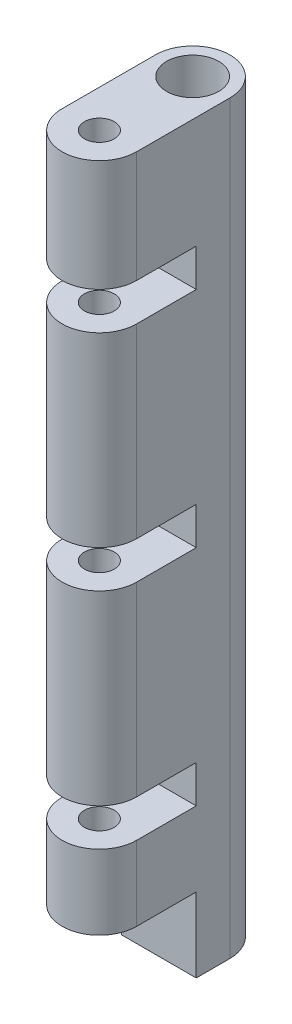
ISO-10303-21;
HEADER;
FILE_DESCRIPTION(('STEP AP214'),'2;1');
FILE_NAME('part.step','',(''),(''),'','','');
FILE_SCHEMA(('AUTOMOTIVE_DESIGN { 1 0 10303 214 1 1 1 1 }'));
ENDSEC;
DATA;
#1=APPLICATION_CONTEXT('core data for automotive mechanical design processes');
#2=APPLICATION_PROTOCOL_DEFINITION('international standard','automotive_design',2000,#1);
#3=PRODUCT_CONTEXT('',#1,'mechanical');
#4=PRODUCT('Part','Part','',(#3));
#5=PRODUCT_RELATED_PRODUCT_CATEGORY('part','',(#4));
#6=PRODUCT_DEFINITION_FORMATION('','',#4);
#7=PRODUCT_DEFINITION_CONTEXT('part definition',#1,'design');
#8=PRODUCT_DEFINITION('design','',#6,#7);
#9=PRODUCT_DEFINITION_SHAPE('','',#8);
#10=(LENGTH_UNIT() NAMED_UNIT(*) SI_UNIT(.MILLI.,.METRE.));
#11=(NAMED_UNIT(*) PLANE_ANGLE_UNIT() SI_UNIT($,.RADIAN.));
#12=(NAMED_UNIT(*) SI_UNIT($,.STERADIAN.) SOLID_ANGLE_UNIT());
#13=UNCERTAINTY_MEASURE_WITH_UNIT(LENGTH_MEASURE(1.E-05),#10,'distance_accuracy_value','');
#14=(GEOMETRIC_REPRESENTATION_CONTEXT(3) GLOBAL_UNCERTAINTY_ASSIGNED_CONTEXT((#13)) GLOBAL_UNIT_ASSIGNED_CONTEXT((#10,
#11,#12)) REPRESENTATION_CONTEXT('',''));
#15=CARTESIAN_POINT('',(0.,0.,0.));
#16=DIRECTION('',(0.,0.,1.));
#17=DIRECTION('',(1.,0.,0.));
#18=AXIS2_PLACEMENT_3D('',#15,#16,#17);
#19=CARTESIAN_POINT('',(0.,-25.6177180417115,15.8980893036825));
#20=DIRECTION('',(0.,1.,0.));
#21=DIRECTION('',(0.,0.,1.));
#22=AXIS2_PLACEMENT_3D('',#19,#20,#21);
#23=CYLINDRICAL_SURFACE('',#22,6.35);
#24=CARTESIAN_POINT('',(0.,108.0008,15.8980893036825));
#25=DIRECTION('',(0.,1.,0.));
#26=DIRECTION('',(0.,0.,1.));
#27=AXIS2_PLACEMENT_3D('',#24,#25,#26);
#28=CIRCLE('',#27,6.35);
#29=CARTESIAN_POINT('',(6.35,108.0008,15.8980893036825));
#30=VERTEX_POINT('',#29);
#31=CARTESIAN_POINT('',(-6.35,108.0008,15.8980893036825));
#32=VERTEX_POINT('',#31);
#33=EDGE_CURVE('E299',#30,#32,#28,.F.);
#34=ORIENTED_EDGE('',*,*,#33,.F.);
#35=DIRECTION('',(0.,1.,0.));
#36=VECTOR('',#35,1.);
#37=CARTESIAN_POINT('',(6.35,-25.6177180417115,15.8980893036825));
#38=LINE('',#37,#36);
#39=CARTESIAN_POINT('',(6.35,127.,15.8980893036825));
#40=VERTEX_POINT('',#39);
#41=EDGE_CURVE('E230',#30,#40,#38,.T.);
#42=ORIENTED_EDGE('',*,*,#41,.T.);
#43=CARTESIAN_POINT('',(0.,127.,15.8980893036825));
#44=DIRECTION('',(0.,1.,0.));
#45=DIRECTION('',(0.,0.,1.));
#46=AXIS2_PLACEMENT_3D('',#43,#44,#45);
#47=CIRCLE('',#46,6.35);
#48=CARTESIAN_POINT('',(-6.35,127.,15.8980893036825));
#49=VERTEX_POINT('',#48);
#50=EDGE_CURVE('E221',#49,#40,#47,.T.);
#51=ORIENTED_EDGE('',*,*,#50,.F.);
#52=DIRECTION('',(0.,1.,0.));
#53=VECTOR('',#52,1.);
#54=CARTESIAN_POINT('',(-6.35,-25.6177180417115,15.8980893036825));
#55=LINE('',#54,#53);
#56=EDGE_CURVE('E235',#32,#49,#55,.T.);
#57=ORIENTED_EDGE('',*,*,#56,.F.);
#58=EDGE_LOOP('',(#34,#42,#51,#57));
#59=FACE_BOUND('',#58,.T.);
#60=ADVANCED_FACE('F45',(#59),#23,.T.);
#61=CARTESIAN_POINT('',(0.,101.6,15.8980893036825));
#62=DIRECTION('',(0.,-1.,0.));
#63=DIRECTION('',(0.,0.,-1.));
#64=AXIS2_PLACEMENT_3D('',#61,#62,#63);
#65=CIRCLE('',#64,6.35);
#66=CARTESIAN_POINT('',(-6.35,101.6,15.8980893036825));
#67=VERTEX_POINT('',#66);
#68=CARTESIAN_POINT('',(6.35,101.6,15.8980893036825));
#69=VERTEX_POINT('',#68);
#70=EDGE_CURVE('E71',#67,#69,#65,.F.);
#71=ORIENTED_EDGE('',*,*,#70,.F.);
#72=CARTESIAN_POINT('',(-6.35,69.9008,15.8980893036825));
#73=VERTEX_POINT('',#72);
#74=EDGE_CURVE('E238',#73,#67,#55,.T.);
#75=ORIENTED_EDGE('',*,*,#74,.F.);
#76=CARTESIAN_POINT('',(0.,69.9008,15.8980893036825));
#77=DIRECTION('',(0.,1.,0.));
#78=DIRECTION('',(0.,0.,1.));
#79=AXIS2_PLACEMENT_3D('',#76,#77,#78);
#80=CIRCLE('',#79,6.35);
#81=CARTESIAN_POINT('',(6.35,69.9008,15.8980893036825));
#82=VERTEX_POINT('',#81);
#83=EDGE_CURVE('E277',#82,#73,#80,.F.);
#84=ORIENTED_EDGE('',*,*,#83,.F.);
#85=EDGE_CURVE('E233',#82,#69,#38,.T.);
#86=ORIENTED_EDGE('',*,*,#85,.T.);
#87=EDGE_LOOP('',(#71,#75,#84,#86));
#88=FACE_BOUND('',#87,.T.);
#89=ADVANCED_FACE('F396',(#88),#23,.T.);
#90=CARTESIAN_POINT('',(0.,63.5,15.8980893036825));
#91=DIRECTION('',(0.,-1.,0.));
#92=DIRECTION('',(0.,0.,-1.));
#93=AXIS2_PLACEMENT_3D('',#90,#91,#92);
#94=CIRCLE('',#93,6.35);
#95=CARTESIAN_POINT('',(-6.35,63.5,15.8980893036825));
#96=VERTEX_POINT('',#95);
#97=CARTESIAN_POINT('',(6.35,63.5,15.8980893036825));
#98=VERTEX_POINT('',#97);
#99=EDGE_CURVE('E272',#96,#98,#94,.F.);
#100=ORIENTED_EDGE('',*,*,#99,.F.);
#101=CARTESIAN_POINT('',(-6.35,31.8008,15.8980893036825));
#102=VERTEX_POINT('',#101);
#103=EDGE_CURVE('E338',#102,#96,#55,.T.);
#104=ORIENTED_EDGE('',*,*,#103,.F.);
#105=CARTESIAN_POINT('',(0.,31.8008,15.8980893036825));
#106=DIRECTION('',(0.,1.,0.));
#107=DIRECTION('',(0.,0.,1.));
#108=AXIS2_PLACEMENT_3D('',#105,#106,#107);
#109=CIRCLE('',#108,6.35);
#110=CARTESIAN_POINT('',(6.35,31.8008,15.8980893036825));
#111=VERTEX_POINT('',#110);
#112=EDGE_CURVE('E260',#111,#102,#109,.F.);
#113=ORIENTED_EDGE('',*,*,#112,.F.);
#114=EDGE_CURVE('E389',#111,#98,#38,.T.);
#115=ORIENTED_EDGE('',*,*,#114,.T.);
#116=EDGE_LOOP('',(#100,#104,#113,#115));
#117=FACE_BOUND('',#116,.T.);
#118=ADVANCED_FACE('F386',(#117),#23,.T.);
#119=CARTESIAN_POINT('',(0.,-25.6177180417115,15.8980893036825));
#120=DIRECTION('',(0.,1.,0.));
#121=DIRECTION('',(0.,0.,1.));
#122=AXIS2_PLACEMENT_3D('',#119,#120,#121);
#123=CYLINDRICAL_SURFACE('',#122,2.54);
#124=CARTESIAN_POINT('',(0.,108.0008,15.8980893036825));
#125=DIRECTION('',(0.,1.,0.));
#126=DIRECTION('',(0.,0.,1.));
#127=AXIS2_PLACEMENT_3D('',#124,#125,#126);
#128=CIRCLE('',#127,2.54);
#129=CARTESIAN_POINT('',(0.,108.0008,18.4380893036825));
#130=VERTEX_POINT('',#129);
#131=EDGE_CURVE('E49',#130,#130,#128,.F.);
#132=ORIENTED_EDGE('',*,*,#131,.T.);
#133=EDGE_LOOP('',(#132));
#134=FACE_BOUND('',#133,.T.);
#135=CARTESIAN_POINT('',(0.,127.,15.8980893036825));
#136=DIRECTION('',(0.,1.,0.));
#137=DIRECTION('',(0.,0.,1.));
#138=AXIS2_PLACEMENT_3D('',#135,#136,#137);
#139=CIRCLE('',#138,2.54);
#140=CARTESIAN_POINT('',(0.,127.,18.4380893036825));
#141=VERTEX_POINT('',#140);
#142=EDGE_CURVE('E212',#141,#141,#139,.T.);
#143=ORIENTED_EDGE('',*,*,#142,.T.);
#144=EDGE_LOOP('',(#143));
#145=FACE_BOUND('',#144,.T.);
#146=ADVANCED_FACE('F451',(#134,#145),#123,.F.);
#147=CARTESIAN_POINT('',(0.,127.,0.));
#148=DIRECTION('',(0.,-1.,0.));
#149=DIRECTION('',(0.,0.,-1.));
#150=AXIS2_PLACEMENT_3D('',#147,#148,#149);
#151=CYLINDRICAL_SURFACE('',#150,6.35);
#152=DIRECTION('',(0.,1.,0.));
#153=VECTOR('',#152,1.);
#154=CARTESIAN_POINT('',(-6.35,-25.6177180417115,0.));
#155=LINE('',#154,#153);
#156=CARTESIAN_POINT('',(-6.35,0.,0.));
#157=VERTEX_POINT('',#156);
#158=CARTESIAN_POINT('',(-6.35,127.,0.));
#159=VERTEX_POINT('',#158);
#160=EDGE_CURVE('E228',#157,#159,#155,.T.);
#161=ORIENTED_EDGE('',*,*,#160,.T.);
#162=CARTESIAN_POINT('',(0.,127.,0.));
#163=DIRECTION('',(0.,1.,0.));
#164=DIRECTION('',(0.,0.,1.));
#165=AXIS2_PLACEMENT_3D('',#162,#163,#164);
#166=CIRCLE('',#165,6.35);
#167=CARTESIAN_POINT('',(6.35,127.,0.));
#168=VERTEX_POINT('',#167);
#169=EDGE_CURVE('E11',#168,#159,#166,.T.);
#170=ORIENTED_EDGE('',*,*,#169,.F.);
#171=DIRECTION('',(0.,1.,0.));
#172=VECTOR('',#171,1.);
#173=CARTESIAN_POINT('',(6.35,-25.6177180417115,0.));
#174=LINE('',#173,#172);
#175=CARTESIAN_POINT('',(6.35,0.,0.));
#176=VERTEX_POINT('',#175);
#177=EDGE_CURVE('E202',#176,#168,#174,.T.);
#178=ORIENTED_EDGE('',*,*,#177,.F.);
#179=CARTESIAN_POINT('',(0.,0.,0.));
#180=DIRECTION('',(0.,1.,0.));
#181=DIRECTION('',(0.,0.,1.));
#182=AXIS2_PLACEMENT_3D('',#179,#180,#181);
#183=CIRCLE('',#182,6.35);
#184=EDGE_CURVE('E55',#176,#157,#183,.T.);
#185=ORIENTED_EDGE('',*,*,#184,.T.);
#186=EDGE_LOOP('',(#161,#170,#178,#185));
#187=FACE_BOUND('',#186,.T.);
#188=ADVANCED_FACE('F47',(#187),#151,.T.);
#189=CARTESIAN_POINT('',(0.,127.,0.));
#190=DIRECTION('',(0.,1.,0.));
#191=DIRECTION('',(0.,0.,1.));
#192=AXIS2_PLACEMENT_3D('',#189,#190,#191);
#193=PLANE('',#192);
#194=ORIENTED_EDGE('',*,*,#169,.T.);
#195=DIRECTION('',(0.,0.,1.));
#196=VECTOR('',#195,1.);
#197=CARTESIAN_POINT('',(-6.35,127.,0.));
#198=LINE('',#197,#196);
#199=EDGE_CURVE('E216',#159,#49,#198,.T.);
#200=ORIENTED_EDGE('',*,*,#199,.T.);
#201=ORIENTED_EDGE('',*,*,#50,.T.);
#202=DIRECTION('',(0.,0.,-1.));
#203=VECTOR('',#202,1.);
#204=CARTESIAN_POINT('',(6.35,127.,0.));
#205=LINE('',#204,#203);
#206=EDGE_CURVE('E225',#40,#168,#205,.T.);
#207=ORIENTED_EDGE('',*,*,#206,.T.);
#208=EDGE_LOOP('',(#194,#200,#201,#207));
#209=FACE_BOUND('',#208,.T.);
#210=CARTESIAN_POINT('',(0.,127.,0.));
#211=DIRECTION('',(0.,1.,0.));
#212=DIRECTION('',(0.,0.,1.));
#213=AXIS2_PLACEMENT_3D('',#210,#211,#212);
#214=CIRCLE('',#213,4.445);
#215=CARTESIAN_POINT('',(0.,127.,4.445));
#216=VERTEX_POINT('',#215);
#217=EDGE_CURVE('E241',#216,#216,#214,.T.);
#218=ORIENTED_EDGE('',*,*,#217,.F.);
#219=EDGE_LOOP('',(#218));
#220=FACE_BOUND('',#219,.T.);
#221=ORIENTED_EDGE('',*,*,#142,.F.);
#222=EDGE_LOOP('',(#221));
#223=FACE_BOUND('',#222,.T.);
#224=ADVANCED_FACE('F477',(#209,#220,#223),#193,.T.);
#225=CARTESIAN_POINT('',(0.,0.,0.));
#226=DIRECTION('',(0.,1.,0.));
#227=DIRECTION('',(0.,0.,1.));
#228=AXIS2_PLACEMENT_3D('',#225,#226,#227);
#229=PLANE('',#228);
#230=DIRECTION('',(0.,0.,1.));
#231=VECTOR('',#230,1.);
#232=CARTESIAN_POINT('',(6.35,0.,0.));
#233=LINE('',#232,#231);
#234=CARTESIAN_POINT('',(6.35,0.,5.73808930368251));
#235=VERTEX_POINT('',#234);
#236=EDGE_CURVE('E190',#176,#235,#233,.T.);
#237=ORIENTED_EDGE('',*,*,#236,.T.);
#238=DIRECTION('',(1.,0.,0.));
#239=VECTOR('',#238,1.);
#240=CARTESIAN_POINT('',(-120.65,0.,5.7380893036825));
#241=LINE('',#240,#239);
#242=CARTESIAN_POINT('',(-6.34999999999999,0.,5.73808930368251));
#243=VERTEX_POINT('',#242);
#244=EDGE_CURVE('E173',#243,#235,#241,.T.);
#245=ORIENTED_EDGE('',*,*,#244,.F.);
#246=DIRECTION('',(0.,0.,-1.));
#247=VECTOR('',#246,1.);
#248=CARTESIAN_POINT('',(-6.35,0.,0.));
#249=LINE('',#248,#247);
#250=EDGE_CURVE('E201',#243,#157,#249,.T.);
#251=ORIENTED_EDGE('',*,*,#250,.T.);
#252=ORIENTED_EDGE('',*,*,#184,.F.);
#253=EDGE_LOOP('',(#237,#245,#251,#252));
#254=FACE_BOUND('',#253,.T.);
#255=CARTESIAN_POINT('',(0.,0.,0.));
#256=DIRECTION('',(0.,1.,0.));
#257=DIRECTION('',(0.,0.,1.));
#258=AXIS2_PLACEMENT_3D('',#255,#256,#257);
#259=CIRCLE('',#258,4.445);
#260=CARTESIAN_POINT('',(0.,0.,4.445));
#261=VERTEX_POINT('',#260);
#262=EDGE_CURVE('E206',#261,#261,#259,.T.);
#263=ORIENTED_EDGE('',*,*,#262,.T.);
#264=EDGE_LOOP('',(#263));
#265=FACE_BOUND('',#264,.T.);
#266=ADVANCED_FACE('F196',(#254,#265),#229,.F.);
#267=CARTESIAN_POINT('',(0.,127.,0.));
#268=DIRECTION('',(0.,-1.,0.));
#269=DIRECTION('',(0.,0.,-1.));
#270=AXIS2_PLACEMENT_3D('',#267,#268,#269);
#271=CYLINDRICAL_SURFACE('',#270,4.445);
#272=ORIENTED_EDGE('',*,*,#217,.T.);
#273=EDGE_LOOP('',(#272));
#274=FACE_BOUND('',#273,.T.);
#275=ORIENTED_EDGE('',*,*,#262,.F.);
#276=EDGE_LOOP('',(#275));
#277=FACE_BOUND('',#276,.T.);
#278=ADVANCED_FACE('F468',(#274,#277),#271,.F.);
#279=CARTESIAN_POINT('',(-6.35,-25.6177180417115,0.));
#280=DIRECTION('',(-1.,0.,0.));
#281=DIRECTION('',(0.,0.,1.));
#282=AXIS2_PLACEMENT_3D('',#279,#280,#281);
#283=PLANE('',#282);
#284=DIRECTION('',(0.,0.,-1.));
#285=VECTOR('',#284,1.);
#286=CARTESIAN_POINT('',(-6.35,108.0008,0.));
#287=LINE('',#286,#285);
#288=CARTESIAN_POINT('',(-6.34999999999999,108.0008,5.73808930368277));
#289=VERTEX_POINT('',#288);
#290=EDGE_CURVE('E302',#32,#289,#287,.T.);
#291=ORIENTED_EDGE('',*,*,#290,.F.);
#292=ORIENTED_EDGE('',*,*,#56,.T.);
#293=ORIENTED_EDGE('',*,*,#199,.F.);
#294=ORIENTED_EDGE('',*,*,#160,.F.);
#295=ORIENTED_EDGE('',*,*,#250,.F.);
#296=DIRECTION('',(0.,-1.,0.));
#297=VECTOR('',#296,1.);
#298=CARTESIAN_POINT('',(-6.35,-25.6177180417115,5.73808930368251));
#299=LINE('',#298,#297);
#300=CARTESIAN_POINT('',(-6.34999999999999,12.7,5.73808930368251));
#301=VERTEX_POINT('',#300);
#302=EDGE_CURVE('E176',#301,#243,#299,.T.);
#303=ORIENTED_EDGE('',*,*,#302,.F.);
#304=DIRECTION('',(0.,0.,-1.));
#305=VECTOR('',#304,1.);
#306=CARTESIAN_POINT('',(-6.35,12.7,0.));
#307=LINE('',#306,#305);
#308=CARTESIAN_POINT('',(-6.35,12.7,15.8980893036825));
#309=VERTEX_POINT('',#308);
#310=EDGE_CURVE('E273',#309,#301,#307,.T.);
#311=ORIENTED_EDGE('',*,*,#310,.F.);
#312=CARTESIAN_POINT('',(-6.35,25.4,15.8980893036825));
#313=VERTEX_POINT('',#312);
#314=EDGE_CURVE('E234',#309,#313,#55,.T.);
#315=ORIENTED_EDGE('',*,*,#314,.T.);
#316=DIRECTION('',(0.,0.,1.));
#317=VECTOR('',#316,1.);
#318=CARTESIAN_POINT('',(-6.35,25.4,0.));
#319=LINE('',#318,#317);
#320=CARTESIAN_POINT('',(-6.34999999999999,25.4,5.73808930368251));
#321=VERTEX_POINT('',#320);
#322=EDGE_CURVE('E261',#321,#313,#319,.T.);
#323=ORIENTED_EDGE('',*,*,#322,.F.);
#324=DIRECTION('',(0.,-1.,0.));
#325=VECTOR('',#324,1.);
#326=CARTESIAN_POINT('',(-6.35,-25.6177180417115,5.73808930368248));
#327=LINE('',#326,#325);
#328=CARTESIAN_POINT('',(-6.34999999999999,31.8008,5.73808930368251));
#329=VERTEX_POINT('',#328);
#330=EDGE_CURVE('E305',#329,#321,#327,.T.);
#331=ORIENTED_EDGE('',*,*,#330,.F.);
#332=DIRECTION('',(0.,0.,-1.));
#333=VECTOR('',#332,1.);
#334=CARTESIAN_POINT('',(-6.35,31.8008,0.));
#335=LINE('',#334,#333);
#336=EDGE_CURVE('E267',#102,#329,#335,.T.);
#337=ORIENTED_EDGE('',*,*,#336,.F.);
#338=ORIENTED_EDGE('',*,*,#103,.T.);
#339=DIRECTION('',(0.,0.,1.));
#340=VECTOR('',#339,1.);
#341=CARTESIAN_POINT('',(-6.35,63.5,0.));
#342=LINE('',#341,#340);
#343=CARTESIAN_POINT('',(-6.34999999999999,63.5,5.73808930368264));
#344=VERTEX_POINT('',#343);
#345=EDGE_CURVE('E278',#344,#96,#342,.T.);
#346=ORIENTED_EDGE('',*,*,#345,.F.);
#347=DIRECTION('',(0.,-1.,0.));
#348=VECTOR('',#347,1.);
#349=CARTESIAN_POINT('',(-6.35,-25.6177180417115,5.73808930368259));
#350=LINE('',#349,#348);
#351=CARTESIAN_POINT('',(-6.34999999999999,69.9008,5.73808930368264));
#352=VERTEX_POINT('',#351);
#353=EDGE_CURVE('E310',#352,#344,#350,.T.);
#354=ORIENTED_EDGE('',*,*,#353,.F.);
#355=DIRECTION('',(0.,0.,-1.));
#356=VECTOR('',#355,1.);
#357=CARTESIAN_POINT('',(-6.35,69.9008,0.));
#358=LINE('',#357,#356);
#359=EDGE_CURVE('E282',#73,#352,#358,.T.);
#360=ORIENTED_EDGE('',*,*,#359,.F.);
#361=ORIENTED_EDGE('',*,*,#74,.T.);
#362=DIRECTION('',(0.,0.,1.));
#363=VECTOR('',#362,1.);
#364=CARTESIAN_POINT('',(-6.35,101.6,0.));
#365=LINE('',#364,#363);
#366=CARTESIAN_POINT('',(-6.34999999999999,101.6,5.73808930368277));
#367=VERTEX_POINT('',#366);
#368=EDGE_CURVE('E287',#367,#67,#365,.T.);
#369=ORIENTED_EDGE('',*,*,#368,.F.);
#370=DIRECTION('',(0.,-1.,0.));
#371=VECTOR('',#370,1.);
#372=CARTESIAN_POINT('',(-6.35,-25.6177180417115,5.7380893036827));
#373=LINE('',#372,#371);
#374=EDGE_CURVE('E217',#289,#367,#373,.T.);
#375=ORIENTED_EDGE('',*,*,#374,.F.);
#376=EDGE_LOOP('',(#291,#292,#293,#294,#295,#303,#311,#315,#323,#331,#337,#338,#346,#354,#360,
#361,#369,#375));
#377=FACE_BOUND('',#376,.T.);
#378=ADVANCED_FACE('F332',(#377),#283,.T.);
#379=CARTESIAN_POINT('',(0.,12.7,15.8980893036825));
#380=DIRECTION('',(0.,1.,0.));
#381=DIRECTION('',(0.,0.,1.));
#382=AXIS2_PLACEMENT_3D('',#379,#380,#381);
#383=CIRCLE('',#382,6.35);
#384=CARTESIAN_POINT('',(6.35,12.7,15.8980893036825));
#385=VERTEX_POINT('',#384);
#386=EDGE_CURVE('E266',#385,#309,#383,.F.);
#387=ORIENTED_EDGE('',*,*,#386,.F.);
#388=CARTESIAN_POINT('',(6.35,25.4,15.8980893036825));
#389=VERTEX_POINT('',#388);
#390=EDGE_CURVE('E208',#385,#389,#38,.T.);
#391=ORIENTED_EDGE('',*,*,#390,.T.);
#392=CARTESIAN_POINT('',(0.,25.4,15.8980893036825));
#393=DIRECTION('',(0.,-1.,0.));
#394=DIRECTION('',(0.,0.,-1.));
#395=AXIS2_PLACEMENT_3D('',#392,#393,#394);
#396=CIRCLE('',#395,6.35);
#397=EDGE_CURVE('E254',#313,#389,#396,.F.);
#398=ORIENTED_EDGE('',*,*,#397,.F.);
#399=ORIENTED_EDGE('',*,*,#314,.F.);
#400=EDGE_LOOP('',(#387,#391,#398,#399));
#401=FACE_BOUND('',#400,.T.);
#402=ADVANCED_FACE('F353',(#401),#23,.T.);
#403=CARTESIAN_POINT('',(6.35,-25.6177180417115,0.));
#404=DIRECTION('',(1.,0.,0.));
#405=DIRECTION('',(0.,0.,-1.));
#406=AXIS2_PLACEMENT_3D('',#403,#404,#405);
#407=PLANE('',#406);
#408=DIRECTION('',(0.,0.,1.));
#409=VECTOR('',#408,1.);
#410=CARTESIAN_POINT('',(6.35,108.0008,37.4880893036828));
#411=LINE('',#410,#409);
#412=CARTESIAN_POINT('',(6.35,108.0008,5.73808930368277));
#413=VERTEX_POINT('',#412);
#414=EDGE_CURVE('E400',#413,#30,#411,.T.);
#415=ORIENTED_EDGE('',*,*,#414,.F.);
#416=DIRECTION('',(0.,1.,0.));
#417=VECTOR('',#416,1.);
#418=CARTESIAN_POINT('',(6.35,108.0008,5.73808930368277));
#419=LINE('',#418,#417);
#420=CARTESIAN_POINT('',(6.35,101.6,5.73808930368277));
#421=VERTEX_POINT('',#420);
#422=EDGE_CURVE('E329',#421,#413,#419,.T.);
#423=ORIENTED_EDGE('',*,*,#422,.F.);
#424=DIRECTION('',(0.,0.,-1.));
#425=VECTOR('',#424,1.);
#426=CARTESIAN_POINT('',(6.35,101.6,37.4880893036828));
#427=LINE('',#426,#425);
#428=EDGE_CURVE('E326',#69,#421,#427,.T.);
#429=ORIENTED_EDGE('',*,*,#428,.F.);
#430=ORIENTED_EDGE('',*,*,#85,.F.);
#431=DIRECTION('',(0.,0.,1.));
#432=VECTOR('',#431,1.);
#433=CARTESIAN_POINT('',(6.35,69.9008,37.4880893036826));
#434=LINE('',#433,#432);
#435=CARTESIAN_POINT('',(6.35,69.9008,5.73808930368264));
#436=VERTEX_POINT('',#435);
#437=EDGE_CURVE('E182',#436,#82,#434,.T.);
#438=ORIENTED_EDGE('',*,*,#437,.F.);
#439=DIRECTION('',(0.,1.,0.));
#440=VECTOR('',#439,1.);
#441=CARTESIAN_POINT('',(6.35,69.9008,5.73808930368264));
#442=LINE('',#441,#440);
#443=CARTESIAN_POINT('',(6.35,63.5,5.73808930368264));
#444=VERTEX_POINT('',#443);
#445=EDGE_CURVE('E726',#444,#436,#442,.T.);
#446=ORIENTED_EDGE('',*,*,#445,.F.);
#447=DIRECTION('',(0.,0.,-1.));
#448=VECTOR('',#447,1.);
#449=CARTESIAN_POINT('',(6.35,63.5,37.4880893036826));
#450=LINE('',#449,#448);
#451=EDGE_CURVE('E723',#98,#444,#450,.T.);
#452=ORIENTED_EDGE('',*,*,#451,.F.);
#453=ORIENTED_EDGE('',*,*,#114,.F.);
#454=DIRECTION('',(0.,0.,1.));
#455=VECTOR('',#454,1.);
#456=CARTESIAN_POINT('',(6.35,31.8008,37.4880893036825));
#457=LINE('',#456,#455);
#458=CARTESIAN_POINT('',(6.35,31.8008,5.73808930368251));
#459=VERTEX_POINT('',#458);
#460=EDGE_CURVE('E415',#459,#111,#457,.T.);
#461=ORIENTED_EDGE('',*,*,#460,.F.);
#462=DIRECTION('',(0.,1.,0.));
#463=VECTOR('',#462,1.);
#464=CARTESIAN_POINT('',(6.35,31.8008,5.73808930368251));
#465=LINE('',#464,#463);
#466=CARTESIAN_POINT('',(6.35,25.4,5.73808930368251));
#467=VERTEX_POINT('',#466);
#468=EDGE_CURVE('E411',#467,#459,#465,.T.);
#469=ORIENTED_EDGE('',*,*,#468,.F.);
#470=DIRECTION('',(0.,0.,-1.));
#471=VECTOR('',#470,1.);
#472=CARTESIAN_POINT('',(6.35,25.4,37.4880893036825));
#473=LINE('',#472,#471);
#474=EDGE_CURVE('E194',#389,#467,#473,.T.);
#475=ORIENTED_EDGE('',*,*,#474,.F.);
#476=ORIENTED_EDGE('',*,*,#390,.F.);
#477=DIRECTION('',(0.,0.,1.));
#478=VECTOR('',#477,1.);
#479=CARTESIAN_POINT('',(6.35,12.7,5.73808930368251));
#480=LINE('',#479,#478);
#481=CARTESIAN_POINT('',(6.35,12.7,5.7380893036825));
#482=VERTEX_POINT('',#481);
#483=EDGE_CURVE('E192',#482,#385,#480,.T.);
#484=ORIENTED_EDGE('',*,*,#483,.F.);
#485=DIRECTION('',(0.,1.,0.));
#486=VECTOR('',#485,1.);
#487=CARTESIAN_POINT('',(6.35,0.,5.73808930368251));
#488=LINE('',#487,#486);
#489=EDGE_CURVE('E63',#235,#482,#488,.T.);
#490=ORIENTED_EDGE('',*,*,#489,.F.);
#491=ORIENTED_EDGE('',*,*,#236,.F.);
#492=ORIENTED_EDGE('',*,*,#177,.T.);
#493=ORIENTED_EDGE('',*,*,#206,.F.);
#494=ORIENTED_EDGE('',*,*,#41,.F.);
#495=EDGE_LOOP('',(#415,#423,#429,#430,#438,#446,#452,#453,#461,#469,#475,#476,#484,#490,#491,
#492,#493,#494));
#496=FACE_BOUND('',#495,.T.);
#497=ADVANCED_FACE('F188',(#496),#407,.T.);
#498=CARTESIAN_POINT('',(-120.65,31.8008,37.4880893036825));
#499=DIRECTION('',(0.,1.,0.));
#500=DIRECTION('',(0.,0.,1.));
#501=AXIS2_PLACEMENT_3D('',#498,#499,#500);
#502=PLANE('',#501);
#503=ORIENTED_EDGE('',*,*,#336,.T.);
#504=DIRECTION('',(1.,0.,0.));
#505=VECTOR('',#504,1.);
#506=CARTESIAN_POINT('',(-120.65,31.8008,5.7380893036825));
#507=LINE('',#506,#505);
#508=EDGE_CURVE('E255',#329,#459,#507,.T.);
#509=ORIENTED_EDGE('',*,*,#508,.T.);
#510=ORIENTED_EDGE('',*,*,#460,.T.);
#511=ORIENTED_EDGE('',*,*,#112,.T.);
#512=EDGE_LOOP('',(#503,#509,#510,#511));
#513=FACE_BOUND('',#512,.T.);
#514=CARTESIAN_POINT('',(0.,31.8008,15.8980893036825));
#515=DIRECTION('',(0.,1.,0.));
#516=DIRECTION('',(0.,0.,1.));
#517=AXIS2_PLACEMENT_3D('',#514,#515,#516);
#518=CIRCLE('',#517,2.54);
#519=CARTESIAN_POINT('',(0.,31.8008,18.4380893036825));
#520=VERTEX_POINT('',#519);
#521=EDGE_CURVE('E256',#520,#520,#518,.F.);
#522=ORIENTED_EDGE('',*,*,#521,.F.);
#523=EDGE_LOOP('',(#522));
#524=FACE_BOUND('',#523,.T.);
#525=ADVANCED_FACE('F427',(#513,#524),#502,.F.);
#526=CARTESIAN_POINT('',(-120.65,25.4,37.4880893036825));
#527=DIRECTION('',(0.,-1.,0.));
#528=DIRECTION('',(0.,0.,-1.));
#529=AXIS2_PLACEMENT_3D('',#526,#527,#528);
#530=PLANE('',#529);
#531=ORIENTED_EDGE('',*,*,#322,.T.);
#532=ORIENTED_EDGE('',*,*,#397,.T.);
#533=ORIENTED_EDGE('',*,*,#474,.T.);
#534=DIRECTION('',(1.,0.,0.));
#535=VECTOR('',#534,1.);
#536=CARTESIAN_POINT('',(-120.65,25.4,5.7380893036825));
#537=LINE('',#536,#535);
#538=EDGE_CURVE('E363',#321,#467,#537,.T.);
#539=ORIENTED_EDGE('',*,*,#538,.F.);
#540=EDGE_LOOP('',(#531,#532,#533,#539));
#541=FACE_BOUND('',#540,.T.);
#542=CARTESIAN_POINT('',(0.,25.4,15.8980893036825));
#543=DIRECTION('',(0.,-1.,0.));
#544=DIRECTION('',(0.,0.,-1.));
#545=AXIS2_PLACEMENT_3D('',#542,#543,#544);
#546=CIRCLE('',#545,2.54);
#547=CARTESIAN_POINT('',(0.,25.4,13.3580893036825));
#548=VERTEX_POINT('',#547);
#549=EDGE_CURVE('E250',#548,#548,#546,.F.);
#550=ORIENTED_EDGE('',*,*,#549,.F.);
#551=EDGE_LOOP('',(#550));
#552=FACE_BOUND('',#551,.T.);
#553=ADVANCED_FACE('F425',(#541,#552),#530,.F.);
#554=CARTESIAN_POINT('',(-120.65,31.8008,5.7380893036825));
#555=DIRECTION('',(0.,0.,-1.));
#556=DIRECTION('',(0.,1.,0.));
#557=AXIS2_PLACEMENT_3D('',#554,#555,#556);
#558=PLANE('',#557);
#559=ORIENTED_EDGE('',*,*,#330,.T.);
#560=ORIENTED_EDGE('',*,*,#538,.T.);
#561=ORIENTED_EDGE('',*,*,#468,.T.);
#562=ORIENTED_EDGE('',*,*,#508,.F.);
#563=EDGE_LOOP('',(#559,#560,#561,#562));
#564=FACE_BOUND('',#563,.T.);
#565=ADVANCED_FACE('F423',(#564),#558,.F.);
#566=CARTESIAN_POINT('',(0.,63.5,15.8980893036825));
#567=DIRECTION('',(0.,-1.,0.));
#568=DIRECTION('',(0.,0.,-1.));
#569=AXIS2_PLACEMENT_3D('',#566,#567,#568);
#570=CIRCLE('',#569,2.54);
#571=CARTESIAN_POINT('',(0.,63.5,13.3580893036825));
#572=VERTEX_POINT('',#571);
#573=EDGE_CURVE('E268',#572,#572,#570,.F.);
#574=ORIENTED_EDGE('',*,*,#573,.T.);
#575=EDGE_LOOP('',(#574));
#576=FACE_BOUND('',#575,.T.);
#577=ORIENTED_EDGE('',*,*,#521,.T.);
#578=EDGE_LOOP('',(#577));
#579=FACE_BOUND('',#578,.T.);
#580=ADVANCED_FACE('F433',(#576,#579),#123,.F.);
#581=CARTESIAN_POINT('',(-120.65,12.7,5.7380893036825));
#582=DIRECTION('',(0.,1.,0.));
#583=DIRECTION('',(0.,0.,1.));
#584=AXIS2_PLACEMENT_3D('',#581,#582,#583);
#585=PLANE('',#584);
#586=ORIENTED_EDGE('',*,*,#310,.T.);
#587=DIRECTION('',(1.,0.,0.));
#588=VECTOR('',#587,1.);
#589=CARTESIAN_POINT('',(-120.65,12.7,5.7380893036825));
#590=LINE('',#589,#588);
#591=EDGE_CURVE('E181',#301,#482,#590,.T.);
#592=ORIENTED_EDGE('',*,*,#591,.T.);
#593=ORIENTED_EDGE('',*,*,#483,.T.);
#594=ORIENTED_EDGE('',*,*,#386,.T.);
#595=EDGE_LOOP('',(#586,#592,#593,#594));
#596=FACE_BOUND('',#595,.T.);
#597=CARTESIAN_POINT('',(0.,12.7,15.8980893036825));
#598=DIRECTION('',(0.,1.,0.));
#599=DIRECTION('',(0.,0.,1.));
#600=AXIS2_PLACEMENT_3D('',#597,#598,#599);
#601=CIRCLE('',#600,2.54);
#602=CARTESIAN_POINT('',(0.,12.7,18.4380893036825));
#603=VERTEX_POINT('',#602);
#604=EDGE_CURVE('E262',#603,#603,#601,.F.);
#605=ORIENTED_EDGE('',*,*,#604,.F.);
#606=EDGE_LOOP('',(#605));
#607=FACE_BOUND('',#606,.T.);
#608=ADVANCED_FACE('F435',(#596,#607),#585,.F.);
#609=CARTESIAN_POINT('',(-120.65,0.,5.7380893036825));
#610=DIRECTION('',(0.,0.,-1.));
#611=DIRECTION('',(-1.,0.,0.));
#612=AXIS2_PLACEMENT_3D('',#609,#610,#611);
#613=PLANE('',#612);
#614=ORIENTED_EDGE('',*,*,#302,.T.);
#615=ORIENTED_EDGE('',*,*,#244,.T.);
#616=ORIENTED_EDGE('',*,*,#489,.T.);
#617=ORIENTED_EDGE('',*,*,#591,.F.);
#618=EDGE_LOOP('',(#614,#615,#616,#617));
#619=FACE_BOUND('',#618,.T.);
#620=ADVANCED_FACE('F174',(#619),#613,.F.);
#621=CARTESIAN_POINT('',(-120.65,69.9008,37.4880893036826));
#622=DIRECTION('',(0.,1.,0.));
#623=DIRECTION('',(0.,0.,1.));
#624=AXIS2_PLACEMENT_3D('',#621,#622,#623);
#625=PLANE('',#624);
#626=ORIENTED_EDGE('',*,*,#359,.T.);
#627=DIRECTION('',(1.,0.,0.));
#628=VECTOR('',#627,1.);
#629=CARTESIAN_POINT('',(-120.65,69.9008,5.73808930368264));
#630=LINE('',#629,#628);
#631=EDGE_CURVE('E404',#352,#436,#630,.T.);
#632=ORIENTED_EDGE('',*,*,#631,.T.);
#633=ORIENTED_EDGE('',*,*,#437,.T.);
#634=ORIENTED_EDGE('',*,*,#83,.T.);
#635=EDGE_LOOP('',(#626,#632,#633,#634));
#636=FACE_BOUND('',#635,.T.);
#637=CARTESIAN_POINT('',(0.,69.9008,15.8980893036825));
#638=DIRECTION('',(0.,1.,0.));
#639=DIRECTION('',(0.,0.,1.));
#640=AXIS2_PLACEMENT_3D('',#637,#638,#639);
#641=CIRCLE('',#640,2.54);
#642=CARTESIAN_POINT('',(0.,69.9008,18.4380893036825));
#643=VERTEX_POINT('',#642);
#644=EDGE_CURVE('E274',#643,#643,#641,.F.);
#645=ORIENTED_EDGE('',*,*,#644,.F.);
#646=EDGE_LOOP('',(#645));
#647=FACE_BOUND('',#646,.T.);
#648=ADVANCED_FACE('F566',(#636,#647),#625,.F.);
#649=CARTESIAN_POINT('',(-120.65,63.5,37.4880893036826));
#650=DIRECTION('',(0.,-1.,0.));
#651=DIRECTION('',(0.,0.,-1.));
#652=AXIS2_PLACEMENT_3D('',#649,#650,#651);
#653=PLANE('',#652);
#654=ORIENTED_EDGE('',*,*,#345,.T.);
#655=ORIENTED_EDGE('',*,*,#99,.T.);
#656=ORIENTED_EDGE('',*,*,#451,.T.);
#657=DIRECTION('',(1.,0.,0.));
#658=VECTOR('',#657,1.);
#659=CARTESIAN_POINT('',(-120.65,63.5,5.73808930368263));
#660=LINE('',#659,#658);
#661=EDGE_CURVE('E383',#344,#444,#660,.T.);
#662=ORIENTED_EDGE('',*,*,#661,.F.);
#663=EDGE_LOOP('',(#654,#655,#656,#662));
#664=FACE_BOUND('',#663,.T.);
#665=ORIENTED_EDGE('',*,*,#573,.F.);
#666=EDGE_LOOP('',(#665));
#667=FACE_BOUND('',#666,.T.);
#668=ADVANCED_FACE('F379',(#664,#667),#653,.F.);
#669=CARTESIAN_POINT('',(-120.65,69.9008,5.73808930368264));
#670=DIRECTION('',(0.,0.,-1.));
#671=DIRECTION('',(0.,1.,0.));
#672=AXIS2_PLACEMENT_3D('',#669,#670,#671);
#673=PLANE('',#672);
#674=ORIENTED_EDGE('',*,*,#353,.T.);
#675=ORIENTED_EDGE('',*,*,#661,.T.);
#676=ORIENTED_EDGE('',*,*,#445,.T.);
#677=ORIENTED_EDGE('',*,*,#631,.F.);
#678=EDGE_LOOP('',(#674,#675,#676,#677));
#679=FACE_BOUND('',#678,.T.);
#680=ADVANCED_FACE('F454',(#679),#673,.F.);
#681=CARTESIAN_POINT('',(0.,101.6,15.8980893036825));
#682=DIRECTION('',(0.,-1.,0.));
#683=DIRECTION('',(0.,0.,-1.));
#684=AXIS2_PLACEMENT_3D('',#681,#682,#683);
#685=CIRCLE('',#684,2.54);
#686=CARTESIAN_POINT('',(0.,101.6,13.3580893036825));
#687=VERTEX_POINT('',#686);
#688=EDGE_CURVE('E279',#687,#687,#685,.F.);
#689=ORIENTED_EDGE('',*,*,#688,.T.);
#690=EDGE_LOOP('',(#689));
#691=FACE_BOUND('',#690,.T.);
#692=ORIENTED_EDGE('',*,*,#644,.T.);
#693=EDGE_LOOP('',(#692));
#694=FACE_BOUND('',#693,.T.);
#695=ADVANCED_FACE('F439',(#691,#694),#123,.F.);
#696=CARTESIAN_POINT('',(-120.65,108.0008,37.4880893036828));
#697=DIRECTION('',(0.,1.,0.));
#698=DIRECTION('',(0.,0.,1.));
#699=AXIS2_PLACEMENT_3D('',#696,#697,#698);
#700=PLANE('',#699);
#701=ORIENTED_EDGE('',*,*,#290,.T.);
#702=DIRECTION('',(1.,0.,0.));
#703=VECTOR('',#702,1.);
#704=CARTESIAN_POINT('',(-120.65,108.0008,5.73808930368277));
#705=LINE('',#704,#703);
#706=EDGE_CURVE('E320',#289,#413,#705,.T.);
#707=ORIENTED_EDGE('',*,*,#706,.T.);
#708=ORIENTED_EDGE('',*,*,#414,.T.);
#709=ORIENTED_EDGE('',*,*,#33,.T.);
#710=EDGE_LOOP('',(#701,#707,#708,#709));
#711=FACE_BOUND('',#710,.T.);
#712=ORIENTED_EDGE('',*,*,#131,.F.);
#713=EDGE_LOOP('',(#712));
#714=FACE_BOUND('',#713,.T.);
#715=ADVANCED_FACE('F453',(#711,#714),#700,.F.);
#716=CARTESIAN_POINT('',(-120.65,101.6,37.4880893036828));
#717=DIRECTION('',(0.,-1.,0.));
#718=DIRECTION('',(0.,0.,-1.));
#719=AXIS2_PLACEMENT_3D('',#716,#717,#718);
#720=PLANE('',#719);
#721=ORIENTED_EDGE('',*,*,#368,.T.);
#722=ORIENTED_EDGE('',*,*,#70,.T.);
#723=ORIENTED_EDGE('',*,*,#428,.T.);
#724=DIRECTION('',(1.,0.,0.));
#725=VECTOR('',#724,1.);
#726=CARTESIAN_POINT('',(-120.65,101.6,5.73808930368276));
#727=LINE('',#726,#725);
#728=EDGE_CURVE('E319',#367,#421,#727,.T.);
#729=ORIENTED_EDGE('',*,*,#728,.F.);
#730=EDGE_LOOP('',(#721,#722,#723,#729));
#731=FACE_BOUND('',#730,.T.);
#732=ORIENTED_EDGE('',*,*,#688,.F.);
#733=EDGE_LOOP('',(#732));
#734=FACE_BOUND('',#733,.T.);
#735=ADVANCED_FACE('F324',(#731,#734),#720,.F.);
#736=CARTESIAN_POINT('',(-120.65,108.0008,5.73808930368277));
#737=DIRECTION('',(0.,0.,-1.));
#738=DIRECTION('',(0.,1.,0.));
#739=AXIS2_PLACEMENT_3D('',#736,#737,#738);
#740=PLANE('',#739);
#741=ORIENTED_EDGE('',*,*,#374,.T.);
#742=ORIENTED_EDGE('',*,*,#728,.T.);
#743=ORIENTED_EDGE('',*,*,#422,.T.);
#744=ORIENTED_EDGE('',*,*,#706,.F.);
#745=EDGE_LOOP('',(#741,#742,#743,#744));
#746=FACE_BOUND('',#745,.T.);
#747=ADVANCED_FACE('F317',(#746),#740,.F.);
#748=ORIENTED_EDGE('',*,*,#604,.T.);
#749=EDGE_LOOP('',(#748));
#750=FACE_BOUND('',#749,.T.);
#751=ORIENTED_EDGE('',*,*,#549,.T.);
#752=EDGE_LOOP('',(#751));
#753=FACE_BOUND('',#752,.T.);
#754=ADVANCED_FACE('F438',(#750,#753),#123,.F.);
#755=CLOSED_SHELL('',(#60,#89,#118,#146,#188,#224,#266,#278,#378,#402,#497,#525,#553,#565,#580,
#608,#620,#648,#668,#680,#695,#715,#735,#747,#754));
#756=MANIFOLD_SOLID_BREP('B2',#755);
#757=ADVANCED_BREP_SHAPE_REPRESENTATION('',(#18,#756),#14);
#758=SHAPE_DEFINITION_REPRESENTATION(#9,#757);
ENDSEC;
END-ISO-10303-21;
